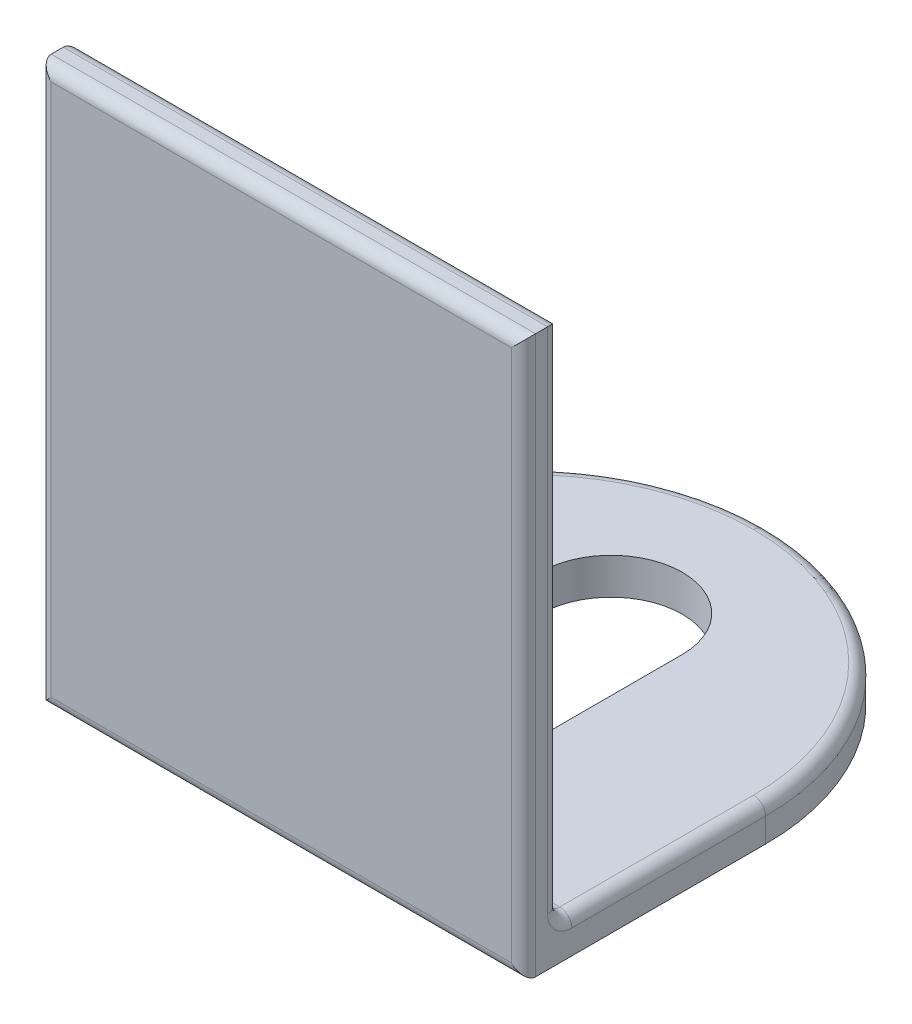
ISO-10303-21;
HEADER;
FILE_DESCRIPTION(('STEP AP214'),'2;1');
FILE_NAME('part.step','',(''),(''),'','','');
FILE_SCHEMA(('AUTOMOTIVE_DESIGN { 1 0 10303 214 1 1 1 1 }'));
ENDSEC;
DATA;
#1=APPLICATION_CONTEXT('core data for automotive mechanical design processes');
#2=APPLICATION_PROTOCOL_DEFINITION('international standard','automotive_design',2000,#1);
#3=PRODUCT_CONTEXT('',#1,'mechanical');
#4=PRODUCT('Part','Part','',(#3));
#5=PRODUCT_RELATED_PRODUCT_CATEGORY('part','',(#4));
#6=PRODUCT_DEFINITION_FORMATION('','',#4);
#7=PRODUCT_DEFINITION_CONTEXT('part definition',#1,'design');
#8=PRODUCT_DEFINITION('design','',#6,#7);
#9=PRODUCT_DEFINITION_SHAPE('','',#8);
#10=(LENGTH_UNIT() NAMED_UNIT(*) SI_UNIT(.MILLI.,.METRE.));
#11=(NAMED_UNIT(*) PLANE_ANGLE_UNIT() SI_UNIT($,.RADIAN.));
#12=(NAMED_UNIT(*) SI_UNIT($,.STERADIAN.) SOLID_ANGLE_UNIT());
#13=UNCERTAINTY_MEASURE_WITH_UNIT(LENGTH_MEASURE(1.E-05),#10,'distance_accuracy_value','');
#14=(GEOMETRIC_REPRESENTATION_CONTEXT(3) GLOBAL_UNCERTAINTY_ASSIGNED_CONTEXT((#13)) GLOBAL_UNIT_ASSIGNED_CONTEXT((#10,
#11,#12)) REPRESENTATION_CONTEXT('',''));
#15=CARTESIAN_POINT('',(0.,0.,0.));
#16=DIRECTION('',(0.,0.,1.));
#17=DIRECTION('',(1.,0.,0.));
#18=AXIS2_PLACEMENT_3D('',#15,#16,#17);
#19=CARTESIAN_POINT('',(0.,3.,0.));
#20=DIRECTION('',(0.,-1.,0.));
#21=DIRECTION('',(0.,0.,-1.));
#22=AXIS2_PLACEMENT_3D('',#19,#20,#21);
#23=PLANE('',#22);
#24=DIRECTION('',(0.,0.,-1.));
#25=VECTOR('',#24,1.);
#26=CARTESIAN_POINT('',(19.,3.,0.));
#27=LINE('',#26,#25);
#28=CARTESIAN_POINT('',(19.,3.,16.));
#29=VERTEX_POINT('',#28);
#30=CARTESIAN_POINT('',(19.,3.,0.));
#31=VERTEX_POINT('',#30);
#32=EDGE_CURVE('E234',#29,#31,#27,.T.);
#33=ORIENTED_EDGE('',*,*,#32,.T.);
#34=CARTESIAN_POINT('',(0.,3.,0.));
#35=DIRECTION('',(0.,-1.,0.));
#36=DIRECTION('',(0.,0.,-1.));
#37=AXIS2_PLACEMENT_3D('',#34,#35,#36);
#38=CIRCLE('',#37,19.);
#39=CARTESIAN_POINT('',(0.,3.,-19.));
#40=VERTEX_POINT('',#39);
#41=EDGE_CURVE('E238',#31,#40,#38,.F.);
#42=ORIENTED_EDGE('',*,*,#41,.T.);
#43=CARTESIAN_POINT('',(0.,3.,0.));
#44=DIRECTION('',(0.,-1.,0.));
#45=DIRECTION('',(0.,0.,-1.));
#46=AXIS2_PLACEMENT_3D('',#43,#44,#45);
#47=CIRCLE('',#46,19.);
#48=CARTESIAN_POINT('',(-19.,3.,0.));
#49=VERTEX_POINT('',#48);
#50=EDGE_CURVE('E236',#40,#49,#47,.F.);
#51=ORIENTED_EDGE('',*,*,#50,.T.);
#52=DIRECTION('',(0.,0.,1.));
#53=VECTOR('',#52,1.);
#54=CARTESIAN_POINT('',(-19.,3.,0.));
#55=LINE('',#54,#53);
#56=CARTESIAN_POINT('',(-19.,3.,16.));
#57=VERTEX_POINT('',#56);
#58=EDGE_CURVE('E232',#49,#57,#55,.T.);
#59=ORIENTED_EDGE('',*,*,#58,.T.);
#60=DIRECTION('',(-1.,0.,0.));
#61=VECTOR('',#60,1.);
#62=CARTESIAN_POINT('',(20.,3.,16.));
#63=LINE('',#62,#61);
#64=EDGE_CURVE('E228',#57,#29,#63,.F.);
#65=ORIENTED_EDGE('',*,*,#64,.T.);
#66=EDGE_LOOP('',(#33,#42,#51,#59,#65));
#67=FACE_BOUND('',#66,.T.);
#68=DIRECTION('',(0.,0.,-1.));
#69=VECTOR('',#68,1.);
#70=CARTESIAN_POINT('',(-5.75711841483233,3.,0.));
#71=LINE('',#70,#69);
#72=CARTESIAN_POINT('',(-5.75711841483233,3.,6.9957850549875));
#73=VERTEX_POINT('',#72);
#74=CARTESIAN_POINT('',(-5.75711841483233,3.,-7.12087355458913));
#75=VERTEX_POINT('',#74);
#76=EDGE_CURVE('E200',#73,#75,#71,.T.);
#77=ORIENTED_EDGE('',*,*,#76,.T.);
#78=CARTESIAN_POINT('',(0.121440792583838,3.,-7.12087355458913));
#79=DIRECTION('',(0.,-1.,0.));
#80=DIRECTION('',(0.,0.,-1.));
#81=AXIS2_PLACEMENT_3D('',#78,#79,#80);
#82=CIRCLE('',#81,5.87855920741616);
#83=CARTESIAN_POINT('',(6.,3.,-7.12087355458913));
#84=VERTEX_POINT('',#83);
#85=EDGE_CURVE('E203',#75,#84,#82,.T.);
#86=ORIENTED_EDGE('',*,*,#85,.T.);
#87=DIRECTION('',(0.,0.,1.));
#88=VECTOR('',#87,1.);
#89=CARTESIAN_POINT('',(6.,3.,0.));
#90=LINE('',#89,#88);
#91=CARTESIAN_POINT('',(6.,3.,5.30593667196655));
#92=VERTEX_POINT('',#91);
#93=EDGE_CURVE('E195',#84,#92,#90,.T.);
#94=ORIENTED_EDGE('',*,*,#93,.T.);
#95=CARTESIAN_POINT('',(0.242881585167673,3.,6.9957850549875));
#96=DIRECTION('',(0.,-1.,0.));
#97=DIRECTION('',(0.,0.,-1.));
#98=AXIS2_PLACEMENT_3D('',#95,#96,#97);
#99=CIRCLE('',#98,6.);
#100=EDGE_CURVE('E170',#92,#73,#99,.T.);
#101=ORIENTED_EDGE('',*,*,#100,.T.);
#102=EDGE_LOOP('',(#77,#86,#94,#101));
#103=FACE_BOUND('',#102,.T.);
#104=ADVANCED_FACE('F33',(#67,#103),#23,.F.);
#105=CARTESIAN_POINT('',(20.,3.,20.));
#106=DIRECTION('',(-1.,0.,0.));
#107=DIRECTION('',(0.,0.,1.));
#108=AXIS2_PLACEMENT_3D('',#105,#106,#107);
#109=PLANE('',#108);
#110=DIRECTION('',(0.,-1.,0.));
#111=VECTOR('',#110,1.);
#112=CARTESIAN_POINT('',(20.,3.,0.));
#113=LINE('',#112,#111);
#114=CARTESIAN_POINT('',(20.,0.,0.));
#115=VERTEX_POINT('',#114);
#116=CARTESIAN_POINT('',(20.,2.,0.));
#117=VERTEX_POINT('',#116);
#118=EDGE_CURVE('E223',#115,#117,#113,.F.);
#119=ORIENTED_EDGE('',*,*,#118,.T.);
#120=DIRECTION('',(0.,0.,-1.));
#121=VECTOR('',#120,1.);
#122=CARTESIAN_POINT('',(20.,2.,20.));
#123=LINE('',#122,#121);
#124=CARTESIAN_POINT('',(20.,2.,16.));
#125=VERTEX_POINT('',#124);
#126=EDGE_CURVE('E253',#117,#125,#123,.F.);
#127=ORIENTED_EDGE('',*,*,#126,.T.);
#128=CARTESIAN_POINT('',(20.,4.,16.));
#129=DIRECTION('',(-1.,0.,0.));
#130=DIRECTION('',(0.,0.,1.));
#131=AXIS2_PLACEMENT_3D('',#128,#129,#130);
#132=CIRCLE('',#131,2.);
#133=CARTESIAN_POINT('',(20.,4.,18.));
#134=VERTEX_POINT('',#133);
#135=EDGE_CURVE('E250',#134,#125,#132,.F.);
#136=ORIENTED_EDGE('',*,*,#135,.F.);
#137=DIRECTION('',(0.,-1.,0.));
#138=VECTOR('',#137,1.);
#139=CARTESIAN_POINT('',(20.,3.,18.));
#140=LINE('',#139,#138);
#141=CARTESIAN_POINT('',(20.,46.,18.));
#142=VERTEX_POINT('',#141);
#143=EDGE_CURVE('E248',#134,#142,#140,.F.);
#144=ORIENTED_EDGE('',*,*,#143,.T.);
#145=DIRECTION('',(0.,0.,-1.));
#146=VECTOR('',#145,1.);
#147=CARTESIAN_POINT('',(20.,46.,20.));
#148=LINE('',#147,#146);
#149=CARTESIAN_POINT('',(20.,46.,19.));
#150=VERTEX_POINT('',#149);
#151=EDGE_CURVE('E210',#150,#142,#148,.T.);
#152=ORIENTED_EDGE('',*,*,#151,.F.);
#153=DIRECTION('',(0.,-1.,0.));
#154=VECTOR('',#153,1.);
#155=CARTESIAN_POINT('',(20.,3.,19.));
#156=LINE('',#155,#154);
#157=CARTESIAN_POINT('',(20.,0.,19.));
#158=VERTEX_POINT('',#157);
#159=EDGE_CURVE('E246',#150,#158,#156,.T.);
#160=ORIENTED_EDGE('',*,*,#159,.T.);
#161=DIRECTION('',(0.,0.,-1.));
#162=VECTOR('',#161,1.);
#163=CARTESIAN_POINT('',(20.,0.,20.));
#164=LINE('',#163,#162);
#165=EDGE_CURVE('E213',#158,#115,#164,.T.);
#166=ORIENTED_EDGE('',*,*,#165,.T.);
#167=EDGE_LOOP('',(#119,#127,#136,#144,#152,#160,#166));
#168=FACE_BOUND('',#167,.T.);
#169=ADVANCED_FACE('F331',(#168),#109,.F.);
#170=CARTESIAN_POINT('',(-20.,3.,20.));
#171=DIRECTION('',(1.,0.,0.));
#172=DIRECTION('',(0.,0.,-1.));
#173=AXIS2_PLACEMENT_3D('',#170,#171,#172);
#174=PLANE('',#173);
#175=CARTESIAN_POINT('',(-20.,4.,16.));
#176=DIRECTION('',(1.,0.,0.));
#177=DIRECTION('',(0.,0.,-1.));
#178=AXIS2_PLACEMENT_3D('',#175,#176,#177);
#179=CIRCLE('',#178,2.);
#180=CARTESIAN_POINT('',(-20.,2.,16.));
#181=VERTEX_POINT('',#180);
#182=CARTESIAN_POINT('',(-20.,4.,18.));
#183=VERTEX_POINT('',#182);
#184=EDGE_CURVE('E258',#181,#183,#179,.F.);
#185=ORIENTED_EDGE('',*,*,#184,.F.);
#186=DIRECTION('',(0.,0.,1.));
#187=VECTOR('',#186,1.);
#188=CARTESIAN_POINT('',(-20.,2.,20.));
#189=LINE('',#188,#187);
#190=CARTESIAN_POINT('',(-20.,2.,0.));
#191=VERTEX_POINT('',#190);
#192=EDGE_CURVE('E263',#181,#191,#189,.F.);
#193=ORIENTED_EDGE('',*,*,#192,.T.);
#194=DIRECTION('',(0.,-1.,0.));
#195=VECTOR('',#194,1.);
#196=CARTESIAN_POINT('',(-20.,3.,0.));
#197=LINE('',#196,#195);
#198=CARTESIAN_POINT('',(-20.,0.,0.));
#199=VERTEX_POINT('',#198);
#200=EDGE_CURVE('E226',#191,#199,#197,.T.);
#201=ORIENTED_EDGE('',*,*,#200,.T.);
#202=DIRECTION('',(0.,0.,1.));
#203=VECTOR('',#202,1.);
#204=CARTESIAN_POINT('',(-20.,0.,20.));
#205=LINE('',#204,#203);
#206=CARTESIAN_POINT('',(-20.,0.,19.));
#207=VERTEX_POINT('',#206);
#208=EDGE_CURVE('E215',#199,#207,#205,.T.);
#209=ORIENTED_EDGE('',*,*,#208,.T.);
#210=DIRECTION('',(0.,-1.,0.));
#211=VECTOR('',#210,1.);
#212=CARTESIAN_POINT('',(-20.,3.,19.));
#213=LINE('',#212,#211);
#214=CARTESIAN_POINT('',(-20.,46.,19.));
#215=VERTEX_POINT('',#214);
#216=EDGE_CURVE('E255',#207,#215,#213,.F.);
#217=ORIENTED_EDGE('',*,*,#216,.T.);
#218=DIRECTION('',(0.,0.,1.));
#219=VECTOR('',#218,1.);
#220=CARTESIAN_POINT('',(-20.,46.,20.));
#221=LINE('',#220,#219);
#222=CARTESIAN_POINT('',(-20.,46.,18.));
#223=VERTEX_POINT('',#222);
#224=EDGE_CURVE('E207',#223,#215,#221,.T.);
#225=ORIENTED_EDGE('',*,*,#224,.F.);
#226=DIRECTION('',(0.,-1.,0.));
#227=VECTOR('',#226,1.);
#228=CARTESIAN_POINT('',(-20.,3.,18.));
#229=LINE('',#228,#227);
#230=EDGE_CURVE('E261',#223,#183,#229,.T.);
#231=ORIENTED_EDGE('',*,*,#230,.T.);
#232=EDGE_LOOP('',(#185,#193,#201,#209,#217,#225,#231));
#233=FACE_BOUND('',#232,.T.);
#234=ADVANCED_FACE('F378',(#233),#174,.F.);
#235=CARTESIAN_POINT('',(-20.,3.,20.));
#236=DIRECTION('',(0.,0.,-1.));
#237=DIRECTION('',(-1.,0.,0.));
#238=AXIS2_PLACEMENT_3D('',#235,#236,#237);
#239=PLANE('',#238);
#240=DIRECTION('',(1.,0.,0.));
#241=VECTOR('',#240,1.);
#242=CARTESIAN_POINT('',(-20.,45.,20.));
#243=LINE('',#242,#241);
#244=CARTESIAN_POINT('',(19.,45.,20.));
#245=VERTEX_POINT('',#244);
#246=CARTESIAN_POINT('',(-19.,45.,20.));
#247=VERTEX_POINT('',#246);
#248=EDGE_CURVE('E50',#245,#247,#243,.F.);
#249=ORIENTED_EDGE('',*,*,#248,.T.);
#250=DIRECTION('',(0.,-1.,0.));
#251=VECTOR('',#250,1.);
#252=CARTESIAN_POINT('',(-19.,3.,20.));
#253=LINE('',#252,#251);
#254=CARTESIAN_POINT('',(-19.,1.,20.));
#255=VERTEX_POINT('',#254);
#256=EDGE_CURVE('E42',#247,#255,#253,.T.);
#257=ORIENTED_EDGE('',*,*,#256,.T.);
#258=DIRECTION('',(1.,0.,0.));
#259=VECTOR('',#258,1.);
#260=CARTESIAN_POINT('',(20.,1.,20.));
#261=LINE('',#260,#259);
#262=CARTESIAN_POINT('',(19.,1.,20.));
#263=VERTEX_POINT('',#262);
#264=EDGE_CURVE('E278',#255,#263,#261,.T.);
#265=ORIENTED_EDGE('',*,*,#264,.T.);
#266=DIRECTION('',(0.,-1.,0.));
#267=VECTOR('',#266,1.);
#268=CARTESIAN_POINT('',(19.,3.,20.));
#269=LINE('',#268,#267);
#270=EDGE_CURVE('E55',#263,#245,#269,.F.);
#271=ORIENTED_EDGE('',*,*,#270,.T.);
#272=EDGE_LOOP('',(#249,#257,#265,#271));
#273=FACE_BOUND('',#272,.T.);
#274=ADVANCED_FACE('F386',(#273),#239,.F.);
#275=CARTESIAN_POINT('',(0.,0.,0.));
#276=DIRECTION('',(0.,-1.,0.));
#277=DIRECTION('',(0.,0.,-1.));
#278=AXIS2_PLACEMENT_3D('',#275,#276,#277);
#279=PLANE('',#278);
#280=CARTESIAN_POINT('',(0.121440792583838,0.,-7.12087355458913));
#281=DIRECTION('',(0.,-1.,0.));
#282=DIRECTION('',(0.,0.,1.));
#283=AXIS2_PLACEMENT_3D('',#280,#281,#282);
#284=CIRCLE('',#283,5.87855920741616);
#285=CARTESIAN_POINT('',(-5.75711841483233,0.,-7.12087355458913));
#286=VERTEX_POINT('',#285);
#287=CARTESIAN_POINT('',(6.,0.,-7.12087355458913));
#288=VERTEX_POINT('',#287);
#289=EDGE_CURVE('E183',#286,#288,#284,.T.);
#290=ORIENTED_EDGE('',*,*,#289,.F.);
#291=DIRECTION('',(0.,0.,-1.));
#292=VECTOR('',#291,1.);
#293=CARTESIAN_POINT('',(-5.75711841483233,0.,-7.12087355458913));
#294=LINE('',#293,#292);
#295=CARTESIAN_POINT('',(-5.75711841483233,0.,6.9957850549875));
#296=VERTEX_POINT('',#295);
#297=EDGE_CURVE('E188',#296,#286,#294,.T.);
#298=ORIENTED_EDGE('',*,*,#297,.F.);
#299=CARTESIAN_POINT('',(0.242881585167673,0.,6.9957850549875));
#300=DIRECTION('',(0.,-1.,0.));
#301=DIRECTION('',(0.,0.,-1.));
#302=AXIS2_PLACEMENT_3D('',#299,#300,#301);
#303=CIRCLE('',#302,6.);
#304=CARTESIAN_POINT('',(6.,0.,5.30593667196655));
#305=VERTEX_POINT('',#304);
#306=EDGE_CURVE('E167',#305,#296,#303,.T.);
#307=ORIENTED_EDGE('',*,*,#306,.F.);
#308=DIRECTION('',(0.,0.,1.));
#309=VECTOR('',#308,1.);
#310=CARTESIAN_POINT('',(6.,0.,-7.12087355458913));
#311=LINE('',#310,#309);
#312=EDGE_CURVE('E178',#288,#305,#311,.T.);
#313=ORIENTED_EDGE('',*,*,#312,.F.);
#314=EDGE_LOOP('',(#290,#298,#307,#313));
#315=FACE_BOUND('',#314,.T.);
#316=ORIENTED_EDGE('',*,*,#165,.F.);
#317=DIRECTION('',(1.,0.,0.));
#318=VECTOR('',#317,1.);
#319=CARTESIAN_POINT('',(-20.,0.,19.));
#320=LINE('',#319,#318);
#321=EDGE_CURVE('E11',#158,#207,#320,.F.);
#322=ORIENTED_EDGE('',*,*,#321,.T.);
#323=ORIENTED_EDGE('',*,*,#208,.F.);
#324=CARTESIAN_POINT('',(0.,0.,0.));
#325=DIRECTION('',(0.,-1.,0.));
#326=DIRECTION('',(0.,0.,-1.));
#327=AXIS2_PLACEMENT_3D('',#324,#325,#326);
#328=CIRCLE('',#327,20.);
#329=CARTESIAN_POINT('',(0.,0.,-20.));
#330=VERTEX_POINT('',#329);
#331=EDGE_CURVE('E218',#199,#330,#328,.T.);
#332=ORIENTED_EDGE('',*,*,#331,.T.);
#333=CARTESIAN_POINT('',(0.,0.,0.));
#334=DIRECTION('',(0.,-1.,0.));
#335=DIRECTION('',(0.,0.,-1.));
#336=AXIS2_PLACEMENT_3D('',#333,#334,#335);
#337=CIRCLE('',#336,20.);
#338=EDGE_CURVE('E220',#330,#115,#337,.T.);
#339=ORIENTED_EDGE('',*,*,#338,.T.);
#340=EDGE_LOOP('',(#316,#322,#323,#332,#339));
#341=FACE_BOUND('',#340,.T.);
#342=ADVANCED_FACE('F185',(#315,#341),#279,.T.);
#343=CARTESIAN_POINT('',(-20.,46.,17.));
#344=DIRECTION('',(0.,0.,1.));
#345=DIRECTION('',(1.,0.,0.));
#346=AXIS2_PLACEMENT_3D('',#343,#344,#345);
#347=PLANE('',#346);
#348=DIRECTION('',(-1.,0.,0.));
#349=VECTOR('',#348,1.);
#350=CARTESIAN_POINT('',(-20.,45.,17.));
#351=LINE('',#350,#349);
#352=CARTESIAN_POINT('',(-19.,45.,17.));
#353=VERTEX_POINT('',#352);
#354=CARTESIAN_POINT('',(19.,45.,17.));
#355=VERTEX_POINT('',#354);
#356=EDGE_CURVE('E269',#353,#355,#351,.F.);
#357=ORIENTED_EDGE('',*,*,#356,.T.);
#358=DIRECTION('',(0.,-1.,0.));
#359=VECTOR('',#358,1.);
#360=CARTESIAN_POINT('',(19.,46.,17.));
#361=LINE('',#360,#359);
#362=CARTESIAN_POINT('',(19.,4.,17.));
#363=VERTEX_POINT('',#362);
#364=EDGE_CURVE('E271',#355,#363,#361,.T.);
#365=ORIENTED_EDGE('',*,*,#364,.T.);
#366=DIRECTION('',(-1.,0.,0.));
#367=VECTOR('',#366,1.);
#368=CARTESIAN_POINT('',(-20.,4.,17.));
#369=LINE('',#368,#367);
#370=CARTESIAN_POINT('',(-19.,4.,17.));
#371=VERTEX_POINT('',#370);
#372=EDGE_CURVE('E265',#363,#371,#369,.T.);
#373=ORIENTED_EDGE('',*,*,#372,.T.);
#374=DIRECTION('',(0.,-1.,0.));
#375=VECTOR('',#374,1.);
#376=CARTESIAN_POINT('',(-19.,46.,17.));
#377=LINE('',#376,#375);
#378=EDGE_CURVE('E267',#371,#353,#377,.F.);
#379=ORIENTED_EDGE('',*,*,#378,.T.);
#380=EDGE_LOOP('',(#357,#365,#373,#379));
#381=FACE_BOUND('',#380,.T.);
#382=ADVANCED_FACE('F393',(#381),#347,.F.);
#383=CARTESIAN_POINT('',(0.,46.,0.));
#384=DIRECTION('',(0.,-1.,0.));
#385=DIRECTION('',(0.,0.,-1.));
#386=AXIS2_PLACEMENT_3D('',#383,#384,#385);
#387=PLANE('',#386);
#388=ORIENTED_EDGE('',*,*,#151,.T.);
#389=DIRECTION('',(-1.,0.,0.));
#390=VECTOR('',#389,1.);
#391=CARTESIAN_POINT('',(0.,46.,18.));
#392=LINE('',#391,#390);
#393=EDGE_CURVE('E276',#142,#223,#392,.T.);
#394=ORIENTED_EDGE('',*,*,#393,.T.);
#395=ORIENTED_EDGE('',*,*,#224,.T.);
#396=DIRECTION('',(1.,0.,0.));
#397=VECTOR('',#396,1.);
#398=CARTESIAN_POINT('',(0.,46.,19.));
#399=LINE('',#398,#397);
#400=EDGE_CURVE('E274',#215,#150,#399,.T.);
#401=ORIENTED_EDGE('',*,*,#400,.T.);
#402=EDGE_LOOP('',(#388,#394,#395,#401));
#403=FACE_BOUND('',#402,.T.);
#404=ADVANCED_FACE('F366',(#403),#387,.F.);
#405=CARTESIAN_POINT('',(0.,3.,0.));
#406=DIRECTION('',(0.,-1.,0.));
#407=DIRECTION('',(0.,0.,-1.));
#408=AXIS2_PLACEMENT_3D('',#405,#406,#407);
#409=CYLINDRICAL_SURFACE('',#408,20.);
#410=ORIENTED_EDGE('',*,*,#200,.F.);
#411=CARTESIAN_POINT('',(0.,2.,0.));
#412=DIRECTION('',(0.,-1.,0.));
#413=DIRECTION('',(0.,0.,-1.));
#414=AXIS2_PLACEMENT_3D('',#411,#412,#413);
#415=CIRCLE('',#414,20.);
#416=CARTESIAN_POINT('',(0.,2.,-20.));
#417=VERTEX_POINT('',#416);
#418=EDGE_CURVE('E244',#191,#417,#415,.T.);
#419=ORIENTED_EDGE('',*,*,#418,.T.);
#420=DIRECTION('',(0.,-1.,0.));
#421=VECTOR('',#420,1.);
#422=CARTESIAN_POINT('',(0.,3.,-20.));
#423=LINE('',#422,#421);
#424=EDGE_CURVE('E206',#330,#417,#423,.F.);
#425=ORIENTED_EDGE('',*,*,#424,.F.);
#426=ORIENTED_EDGE('',*,*,#331,.F.);
#427=EDGE_LOOP('',(#410,#419,#425,#426));
#428=FACE_BOUND('',#427,.T.);
#429=ADVANCED_FACE('F408',(#428),#409,.T.);
#430=CARTESIAN_POINT('',(0.,3.,0.));
#431=DIRECTION('',(0.,-1.,0.));
#432=DIRECTION('',(0.,0.,-1.));
#433=AXIS2_PLACEMENT_3D('',#430,#431,#432);
#434=CYLINDRICAL_SURFACE('',#433,20.);
#435=ORIENTED_EDGE('',*,*,#424,.T.);
#436=CARTESIAN_POINT('',(0.,2.,0.));
#437=DIRECTION('',(0.,-1.,0.));
#438=DIRECTION('',(0.,0.,-1.));
#439=AXIS2_PLACEMENT_3D('',#436,#437,#438);
#440=CIRCLE('',#439,20.);
#441=EDGE_CURVE('E241',#417,#117,#440,.T.);
#442=ORIENTED_EDGE('',*,*,#441,.T.);
#443=ORIENTED_EDGE('',*,*,#118,.F.);
#444=ORIENTED_EDGE('',*,*,#338,.F.);
#445=EDGE_LOOP('',(#435,#442,#443,#444));
#446=FACE_BOUND('',#445,.T.);
#447=ADVANCED_FACE('F338',(#446),#434,.T.);
#448=CARTESIAN_POINT('',(0.121440792583838,37.,-7.12087355458913));
#449=DIRECTION('',(0.,-1.,0.));
#450=DIRECTION('',(0.,0.,-1.));
#451=AXIS2_PLACEMENT_3D('',#448,#449,#450);
#452=CYLINDRICAL_SURFACE('',#451,5.87855920741616);
#453=DIRECTION('',(0.,-1.,0.));
#454=VECTOR('',#453,1.);
#455=CARTESIAN_POINT('',(-5.75711841483233,37.,-7.12087355458913));
#456=LINE('',#455,#454);
#457=EDGE_CURVE('E193',#75,#286,#456,.T.);
#458=ORIENTED_EDGE('',*,*,#457,.T.);
#459=ORIENTED_EDGE('',*,*,#289,.T.);
#460=DIRECTION('',(0.,-1.,0.));
#461=VECTOR('',#460,1.);
#462=CARTESIAN_POINT('',(6.,37.,-7.12087355458913));
#463=LINE('',#462,#461);
#464=EDGE_CURVE('E174',#84,#288,#463,.T.);
#465=ORIENTED_EDGE('',*,*,#464,.F.);
#466=ORIENTED_EDGE('',*,*,#85,.F.);
#467=EDGE_LOOP('',(#458,#459,#465,#466));
#468=FACE_BOUND('',#467,.T.);
#469=ADVANCED_FACE('F409',(#468),#452,.F.);
#470=CARTESIAN_POINT('',(-5.75711841483233,37.,-7.12087355458913));
#471=DIRECTION('',(-1.,0.,0.));
#472=DIRECTION('',(0.,0.,1.));
#473=AXIS2_PLACEMENT_3D('',#470,#471,#472);
#474=PLANE('',#473);
#475=DIRECTION('',(0.,-1.,0.));
#476=VECTOR('',#475,1.);
#477=CARTESIAN_POINT('',(-5.75711841483233,37.,6.9957850549875));
#478=LINE('',#477,#476);
#479=EDGE_CURVE('E173',#73,#296,#478,.T.);
#480=ORIENTED_EDGE('',*,*,#479,.T.);
#481=ORIENTED_EDGE('',*,*,#297,.T.);
#482=ORIENTED_EDGE('',*,*,#457,.F.);
#483=ORIENTED_EDGE('',*,*,#76,.F.);
#484=EDGE_LOOP('',(#480,#481,#482,#483));
#485=FACE_BOUND('',#484,.T.);
#486=ADVANCED_FACE('F412',(#485),#474,.F.);
#487=CARTESIAN_POINT('',(0.242881585167673,37.,6.9957850549875));
#488=DIRECTION('',(0.,-1.,0.));
#489=DIRECTION('',(0.,0.,-1.));
#490=AXIS2_PLACEMENT_3D('',#487,#488,#489);
#491=CYLINDRICAL_SURFACE('',#490,6.);
#492=DIRECTION('',(0.,-1.,0.));
#493=VECTOR('',#492,1.);
#494=CARTESIAN_POINT('',(6.,37.,5.30593667196655));
#495=LINE('',#494,#493);
#496=EDGE_CURVE('E162',#92,#305,#495,.T.);
#497=ORIENTED_EDGE('',*,*,#496,.T.);
#498=ORIENTED_EDGE('',*,*,#306,.T.);
#499=ORIENTED_EDGE('',*,*,#479,.F.);
#500=ORIENTED_EDGE('',*,*,#100,.F.);
#501=EDGE_LOOP('',(#497,#498,#499,#500));
#502=FACE_BOUND('',#501,.T.);
#503=ADVANCED_FACE('F164',(#502),#491,.F.);
#504=CARTESIAN_POINT('',(6.,37.,-7.12087355458913));
#505=DIRECTION('',(1.,0.,0.));
#506=DIRECTION('',(0.,0.,-1.));
#507=AXIS2_PLACEMENT_3D('',#504,#505,#506);
#508=PLANE('',#507);
#509=ORIENTED_EDGE('',*,*,#464,.T.);
#510=ORIENTED_EDGE('',*,*,#312,.T.);
#511=ORIENTED_EDGE('',*,*,#496,.F.);
#512=ORIENTED_EDGE('',*,*,#93,.F.);
#513=EDGE_LOOP('',(#509,#510,#511,#512));
#514=FACE_BOUND('',#513,.T.);
#515=ADVANCED_FACE('F179',(#514),#508,.F.);
#516=CARTESIAN_POINT('',(0.,45.,18.));
#517=DIRECTION('',(-1.,0.,0.));
#518=DIRECTION('',(0.,0.,1.));
#519=AXIS2_PLACEMENT_3D('',#516,#517,#518);
#520=CYLINDRICAL_SURFACE('',#519,1.);
#521=CARTESIAN_POINT('',(19.,45.,18.));
#522=DIRECTION('',(-0.707106781186547,0.707106781186547,0.));
#523=DIRECTION('',(-0.707106781186547,-0.707106781186547,0.));
#524=AXIS2_PLACEMENT_3D('',#521,#522,#523);
#525=ELLIPSE('',#524,1.41421356237309,1.);
#526=EDGE_CURVE('E307',#355,#142,#525,.F.);
#527=ORIENTED_EDGE('',*,*,#526,.F.);
#528=ORIENTED_EDGE('',*,*,#356,.F.);
#529=CARTESIAN_POINT('',(-19.,45.,18.));
#530=DIRECTION('',(-0.707106781186547,-0.707106781186547,0.));
#531=DIRECTION('',(0.707106781186547,-0.707106781186547,0.));
#532=AXIS2_PLACEMENT_3D('',#529,#530,#531);
#533=ELLIPSE('',#532,1.41421356237309,1.);
#534=EDGE_CURVE('E310',#223,#353,#533,.T.);
#535=ORIENTED_EDGE('',*,*,#534,.F.);
#536=ORIENTED_EDGE('',*,*,#393,.F.);
#537=EDGE_LOOP('',(#527,#528,#535,#536));
#538=FACE_BOUND('',#537,.T.);
#539=ADVANCED_FACE('F370',(#538),#520,.T.);
#540=CARTESIAN_POINT('',(-19.,3.,18.));
#541=DIRECTION('',(0.,-1.,0.));
#542=DIRECTION('',(0.,0.,-1.));
#543=AXIS2_PLACEMENT_3D('',#540,#541,#542);
#544=CYLINDRICAL_SURFACE('',#543,1.);
#545=ORIENTED_EDGE('',*,*,#534,.T.);
#546=ORIENTED_EDGE('',*,*,#378,.F.);
#547=CARTESIAN_POINT('',(-19.,4.,18.));
#548=DIRECTION('',(0.,-1.,0.));
#549=DIRECTION('',(0.,0.,-1.));
#550=AXIS2_PLACEMENT_3D('',#547,#548,#549);
#551=CIRCLE('',#550,1.);
#552=EDGE_CURVE('E301',#183,#371,#551,.T.);
#553=ORIENTED_EDGE('',*,*,#552,.F.);
#554=ORIENTED_EDGE('',*,*,#230,.F.);
#555=EDGE_LOOP('',(#545,#546,#553,#554));
#556=FACE_BOUND('',#555,.T.);
#557=ADVANCED_FACE('F376',(#556),#544,.T.);
#558=CARTESIAN_POINT('',(19.,46.,18.));
#559=DIRECTION('',(0.,-1.,0.));
#560=DIRECTION('',(0.,0.,-1.));
#561=AXIS2_PLACEMENT_3D('',#558,#559,#560);
#562=CYLINDRICAL_SURFACE('',#561,1.);
#563=ORIENTED_EDGE('',*,*,#526,.T.);
#564=ORIENTED_EDGE('',*,*,#143,.F.);
#565=CARTESIAN_POINT('',(19.,4.,18.));
#566=DIRECTION('',(0.,-1.,0.));
#567=DIRECTION('',(0.,0.,-1.));
#568=AXIS2_PLACEMENT_3D('',#565,#566,#567);
#569=CIRCLE('',#568,1.);
#570=EDGE_CURVE('E298',#363,#134,#569,.T.);
#571=ORIENTED_EDGE('',*,*,#570,.F.);
#572=ORIENTED_EDGE('',*,*,#364,.F.);
#573=EDGE_LOOP('',(#563,#564,#571,#572));
#574=FACE_BOUND('',#573,.T.);
#575=ADVANCED_FACE('F362',(#574),#562,.T.);
#576=CARTESIAN_POINT('',(-20.,4.,16.));
#577=DIRECTION('',(1.,0.,0.));
#578=DIRECTION('',(0.,0.,-1.));
#579=AXIS2_PLACEMENT_3D('',#576,#577,#578);
#580=CYLINDRICAL_SURFACE('',#579,1.);
#581=CARTESIAN_POINT('',(-19.,4.,16.));
#582=DIRECTION('',(1.,0.,0.));
#583=DIRECTION('',(0.,0.,-1.));
#584=AXIS2_PLACEMENT_3D('',#581,#582,#583);
#585=CIRCLE('',#584,1.);
#586=EDGE_CURVE('E304',#371,#57,#585,.T.);
#587=ORIENTED_EDGE('',*,*,#586,.F.);
#588=ORIENTED_EDGE('',*,*,#372,.F.);
#589=CARTESIAN_POINT('',(19.,4.,16.));
#590=DIRECTION('',(-1.,0.,0.));
#591=DIRECTION('',(0.,0.,1.));
#592=AXIS2_PLACEMENT_3D('',#589,#590,#591);
#593=CIRCLE('',#592,1.);
#594=EDGE_CURVE('E296',#29,#363,#593,.T.);
#595=ORIENTED_EDGE('',*,*,#594,.F.);
#596=ORIENTED_EDGE('',*,*,#64,.F.);
#597=EDGE_LOOP('',(#587,#588,#595,#596));
#598=FACE_BOUND('',#597,.T.);
#599=ADVANCED_FACE('F359',(#598),#580,.F.);
#600=CARTESIAN_POINT('',(-19.,4.,16.));
#601=DIRECTION('',(1.,0.,0.));
#602=DIRECTION('',(0.,0.,-1.));
#603=AXIS2_PLACEMENT_3D('',#600,#601,#602);
#604=TOROIDAL_SURFACE('',#603,2.,1.);
#605=ORIENTED_EDGE('',*,*,#552,.T.);
#606=ORIENTED_EDGE('',*,*,#586,.T.);
#607=CARTESIAN_POINT('',(-19.,2.,16.));
#608=DIRECTION('',(0.,0.,1.));
#609=DIRECTION('',(1.,0.,0.));
#610=AXIS2_PLACEMENT_3D('',#607,#608,#609);
#611=CIRCLE('',#610,1.);
#612=EDGE_CURVE('E293',#181,#57,#611,.F.);
#613=ORIENTED_EDGE('',*,*,#612,.F.);
#614=ORIENTED_EDGE('',*,*,#184,.T.);
#615=EDGE_LOOP('',(#605,#606,#613,#614));
#616=FACE_BOUND('',#615,.T.);
#617=ADVANCED_FACE('F459',(#616),#604,.T.);
#618=CARTESIAN_POINT('',(19.,4.,16.));
#619=DIRECTION('',(-1.,0.,0.));
#620=DIRECTION('',(0.,0.,1.));
#621=AXIS2_PLACEMENT_3D('',#618,#619,#620);
#622=TOROIDAL_SURFACE('',#621,2.,1.);
#623=ORIENTED_EDGE('',*,*,#570,.T.);
#624=ORIENTED_EDGE('',*,*,#135,.T.);
#625=CARTESIAN_POINT('',(19.,2.,16.));
#626=DIRECTION('',(0.,0.,1.));
#627=DIRECTION('',(1.,0.,0.));
#628=AXIS2_PLACEMENT_3D('',#625,#626,#627);
#629=CIRCLE('',#628,1.);
#630=EDGE_CURVE('E290',#29,#125,#629,.F.);
#631=ORIENTED_EDGE('',*,*,#630,.F.);
#632=ORIENTED_EDGE('',*,*,#594,.T.);
#633=EDGE_LOOP('',(#623,#624,#631,#632));
#634=FACE_BOUND('',#633,.T.);
#635=ADVANCED_FACE('F346',(#634),#622,.T.);
#636=CARTESIAN_POINT('',(-19.,2.,0.));
#637=DIRECTION('',(0.,0.,1.));
#638=DIRECTION('',(1.,0.,0.));
#639=AXIS2_PLACEMENT_3D('',#636,#637,#638);
#640=CYLINDRICAL_SURFACE('',#639,1.);
#641=ORIENTED_EDGE('',*,*,#612,.T.);
#642=ORIENTED_EDGE('',*,*,#58,.F.);
#643=CARTESIAN_POINT('',(-19.,2.,0.));
#644=DIRECTION('',(0.,0.,-1.));
#645=DIRECTION('',(-1.,0.,0.));
#646=AXIS2_PLACEMENT_3D('',#643,#644,#645);
#647=CIRCLE('',#646,1.);
#648=EDGE_CURVE('E287',#191,#49,#647,.T.);
#649=ORIENTED_EDGE('',*,*,#648,.F.);
#650=ORIENTED_EDGE('',*,*,#192,.F.);
#651=EDGE_LOOP('',(#641,#642,#649,#650));
#652=FACE_BOUND('',#651,.T.);
#653=ADVANCED_FACE('F473',(#652),#640,.T.);
#654=CARTESIAN_POINT('',(19.,2.,0.));
#655=DIRECTION('',(0.,0.,-1.));
#656=DIRECTION('',(-1.,0.,0.));
#657=AXIS2_PLACEMENT_3D('',#654,#655,#656);
#658=CYLINDRICAL_SURFACE('',#657,1.);
#659=ORIENTED_EDGE('',*,*,#630,.T.);
#660=ORIENTED_EDGE('',*,*,#126,.F.);
#661=CARTESIAN_POINT('',(19.,2.,0.));
#662=DIRECTION('',(0.,0.,-1.));
#663=DIRECTION('',(-1.,0.,0.));
#664=AXIS2_PLACEMENT_3D('',#661,#662,#663);
#665=CIRCLE('',#664,1.);
#666=EDGE_CURVE('E285',#31,#117,#665,.T.);
#667=ORIENTED_EDGE('',*,*,#666,.F.);
#668=ORIENTED_EDGE('',*,*,#32,.F.);
#669=EDGE_LOOP('',(#659,#660,#667,#668));
#670=FACE_BOUND('',#669,.T.);
#671=ADVANCED_FACE('F349',(#670),#658,.T.);
#672=CARTESIAN_POINT('',(0.,2.,0.));
#673=DIRECTION('',(0.,-1.,0.));
#674=DIRECTION('',(0.,0.,-1.));
#675=AXIS2_PLACEMENT_3D('',#672,#673,#674);
#676=TOROIDAL_SURFACE('',#675,19.,1.);
#677=ORIENTED_EDGE('',*,*,#648,.T.);
#678=ORIENTED_EDGE('',*,*,#50,.F.);
#679=CARTESIAN_POINT('',(0.,2.,-19.));
#680=DIRECTION('',(1.,0.,0.));
#681=DIRECTION('',(0.,1.,0.));
#682=AXIS2_PLACEMENT_3D('',#679,#680,#681);
#683=CIRCLE('',#682,1.);
#684=EDGE_CURVE('E283',#417,#40,#683,.T.);
#685=ORIENTED_EDGE('',*,*,#684,.F.);
#686=ORIENTED_EDGE('',*,*,#418,.F.);
#687=EDGE_LOOP('',(#677,#678,#685,#686));
#688=FACE_BOUND('',#687,.T.);
#689=ADVANCED_FACE('F487',(#688),#676,.T.);
#690=CARTESIAN_POINT('',(0.,2.,0.));
#691=DIRECTION('',(0.,-1.,0.));
#692=DIRECTION('',(0.,0.,-1.));
#693=AXIS2_PLACEMENT_3D('',#690,#691,#692);
#694=TOROIDAL_SURFACE('',#693,19.,1.);
#695=ORIENTED_EDGE('',*,*,#666,.T.);
#696=ORIENTED_EDGE('',*,*,#441,.F.);
#697=ORIENTED_EDGE('',*,*,#684,.T.);
#698=ORIENTED_EDGE('',*,*,#41,.F.);
#699=EDGE_LOOP('',(#695,#696,#697,#698));
#700=FACE_BOUND('',#699,.T.);
#701=ADVANCED_FACE('F494',(#700),#694,.T.);
#702=CARTESIAN_POINT('',(19.,3.,19.));
#703=DIRECTION('',(0.,-1.,0.));
#704=DIRECTION('',(0.,0.,-1.));
#705=AXIS2_PLACEMENT_3D('',#702,#703,#704);
#706=CYLINDRICAL_SURFACE('',#705,1.);
#707=CARTESIAN_POINT('',(19.,1.,19.));
#708=DIRECTION('',(-0.707106781186547,-0.707106781186547,0.));
#709=DIRECTION('',(-0.707106781186547,0.707106781186547,0.));
#710=AXIS2_PLACEMENT_3D('',#707,#708,#709);
#711=ELLIPSE('',#710,1.41421356237309,1.);
#712=EDGE_CURVE('E316',#158,#263,#711,.T.);
#713=ORIENTED_EDGE('',*,*,#712,.F.);
#714=ORIENTED_EDGE('',*,*,#159,.F.);
#715=CARTESIAN_POINT('',(19.,45.,19.));
#716=DIRECTION('',(0.707106781186547,-0.707106781186547,0.));
#717=DIRECTION('',(-0.707106781186547,-0.707106781186547,0.));
#718=AXIS2_PLACEMENT_3D('',#715,#716,#717);
#719=ELLIPSE('',#718,1.41421356237309,1.);
#720=EDGE_CURVE('E37',#245,#150,#719,.F.);
#721=ORIENTED_EDGE('',*,*,#720,.F.);
#722=ORIENTED_EDGE('',*,*,#270,.F.);
#723=EDGE_LOOP('',(#713,#714,#721,#722));
#724=FACE_BOUND('',#723,.T.);
#725=ADVANCED_FACE('F35',(#724),#706,.T.);
#726=CARTESIAN_POINT('',(0.,45.,19.));
#727=DIRECTION('',(1.,0.,0.));
#728=DIRECTION('',(0.,0.,-1.));
#729=AXIS2_PLACEMENT_3D('',#726,#727,#728);
#730=CYLINDRICAL_SURFACE('',#729,1.);
#731=ORIENTED_EDGE('',*,*,#720,.T.);
#732=ORIENTED_EDGE('',*,*,#400,.F.);
#733=CARTESIAN_POINT('',(-19.,45.,19.));
#734=DIRECTION('',(0.707106781186547,0.707106781186547,0.));
#735=DIRECTION('',(0.707106781186547,-0.707106781186547,0.));
#736=AXIS2_PLACEMENT_3D('',#733,#734,#735);
#737=ELLIPSE('',#736,1.41421356237309,1.);
#738=EDGE_CURVE('E315',#247,#215,#737,.F.);
#739=ORIENTED_EDGE('',*,*,#738,.F.);
#740=ORIENTED_EDGE('',*,*,#248,.F.);
#741=EDGE_LOOP('',(#731,#732,#739,#740));
#742=FACE_BOUND('',#741,.T.);
#743=ADVANCED_FACE('F325',(#742),#730,.T.);
#744=CARTESIAN_POINT('',(-20.,1.,19.));
#745=DIRECTION('',(-1.,0.,0.));
#746=DIRECTION('',(0.,0.,1.));
#747=AXIS2_PLACEMENT_3D('',#744,#745,#746);
#748=CYLINDRICAL_SURFACE('',#747,1.);
#749=ORIENTED_EDGE('',*,*,#712,.T.);
#750=ORIENTED_EDGE('',*,*,#264,.F.);
#751=CARTESIAN_POINT('',(-19.,1.,19.));
#752=DIRECTION('',(-0.707106781186547,0.707106781186547,0.));
#753=DIRECTION('',(-0.707106781186547,-0.707106781186547,0.));
#754=AXIS2_PLACEMENT_3D('',#751,#752,#753);
#755=ELLIPSE('',#754,1.41421356237309,1.);
#756=EDGE_CURVE('E313',#207,#255,#755,.T.);
#757=ORIENTED_EDGE('',*,*,#756,.F.);
#758=ORIENTED_EDGE('',*,*,#321,.F.);
#759=EDGE_LOOP('',(#749,#750,#757,#758));
#760=FACE_BOUND('',#759,.T.);
#761=ADVANCED_FACE('F385',(#760),#748,.T.);
#762=CARTESIAN_POINT('',(-19.,3.,19.));
#763=DIRECTION('',(0.,-1.,0.));
#764=DIRECTION('',(0.,0.,-1.));
#765=AXIS2_PLACEMENT_3D('',#762,#763,#764);
#766=CYLINDRICAL_SURFACE('',#765,1.);
#767=ORIENTED_EDGE('',*,*,#738,.T.);
#768=ORIENTED_EDGE('',*,*,#216,.F.);
#769=ORIENTED_EDGE('',*,*,#756,.T.);
#770=ORIENTED_EDGE('',*,*,#256,.F.);
#771=EDGE_LOOP('',(#767,#768,#769,#770));
#772=FACE_BOUND('',#771,.T.);
#773=ADVANCED_FACE('F383',(#772),#766,.T.);
#774=CLOSED_SHELL('',(#104,#169,#234,#274,#342,#382,#404,#429,#447,#469,#486,#503,#515,#539,
#557,#575,#599,#617,#635,#653,#671,#689,#701,#725,#743,#761,#773));
#775=MANIFOLD_SOLID_BREP('B2',#774);
#776=ADVANCED_BREP_SHAPE_REPRESENTATION('',(#18,#775),#14);
#777=SHAPE_DEFINITION_REPRESENTATION(#9,#776);
ENDSEC;
END-ISO-10303-21;
